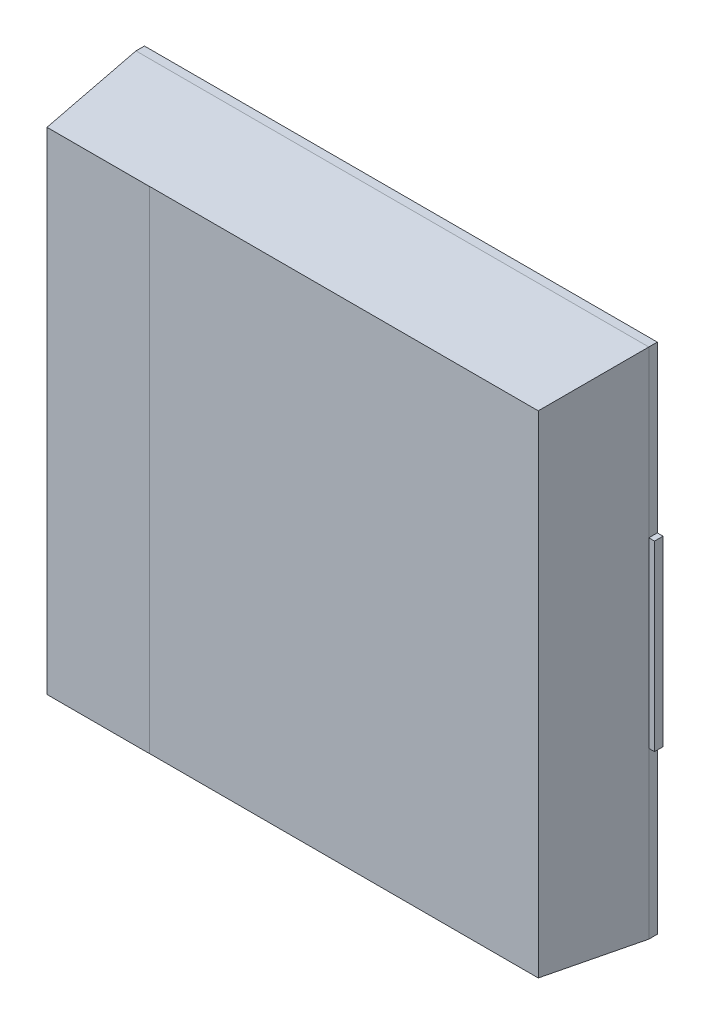
ISO-10303-21;
HEADER;
FILE_DESCRIPTION(('STEP AP214'),'2;1');
FILE_NAME('part.step','',(''),(''),'','','');
FILE_SCHEMA(('AUTOMOTIVE_DESIGN { 1 0 10303 214 1 1 1 1 }'));
ENDSEC;
DATA;
#1=APPLICATION_CONTEXT('core data for automotive mechanical design processes');
#2=APPLICATION_PROTOCOL_DEFINITION('international standard','automotive_design',2000,#1);
#3=PRODUCT_CONTEXT('',#1,'mechanical');
#4=PRODUCT('Part','Part','',(#3));
#5=PRODUCT_RELATED_PRODUCT_CATEGORY('part','',(#4));
#6=PRODUCT_DEFINITION_FORMATION('','',#4);
#7=PRODUCT_DEFINITION_CONTEXT('part definition',#1,'design');
#8=PRODUCT_DEFINITION('design','',#6,#7);
#9=PRODUCT_DEFINITION_SHAPE('','',#8);
#10=(LENGTH_UNIT() NAMED_UNIT(*) SI_UNIT(.MILLI.,.METRE.));
#11=(NAMED_UNIT(*) PLANE_ANGLE_UNIT() SI_UNIT($,.RADIAN.));
#12=(NAMED_UNIT(*) SI_UNIT($,.STERADIAN.) SOLID_ANGLE_UNIT());
#13=UNCERTAINTY_MEASURE_WITH_UNIT(LENGTH_MEASURE(1.E-05),#10,'distance_accuracy_value','');
#14=(GEOMETRIC_REPRESENTATION_CONTEXT(3) GLOBAL_UNCERTAINTY_ASSIGNED_CONTEXT((#13)) GLOBAL_UNIT_ASSIGNED_CONTEXT((#10,
#11,#12)) REPRESENTATION_CONTEXT('',''));
#15=CARTESIAN_POINT('',(0.,0.,0.));
#16=DIRECTION('',(0.,0.,1.));
#17=DIRECTION('',(1.,0.,0.));
#18=AXIS2_PLACEMENT_3D('',#15,#16,#17);
#19=CARTESIAN_POINT('',(0.,0.,0.001));
#20=DIRECTION('',(0.,0.,1.));
#21=DIRECTION('',(1.,0.,0.));
#22=AXIS2_PLACEMENT_3D('',#19,#20,#21);
#23=PLANE('',#22);
#24=DIRECTION('',(0.,1.,0.));
#25=VECTOR('',#24,1.);
#26=CARTESIAN_POINT('',(4.5,-4.5,0.001));
#27=LINE('',#26,#25);
#28=CARTESIAN_POINT('',(4.5,-4.5,0.001));
#29=VERTEX_POINT('',#28);
#30=CARTESIAN_POINT('',(4.5,4.5,0.001));
#31=VERTEX_POINT('',#30);
#32=EDGE_CURVE('P0_E11',#29,#31,#27,.T.);
#33=ORIENTED_EDGE('',*,*,#32,.F.);
#34=DIRECTION('',(1.,0.,0.));
#35=VECTOR('',#34,1.);
#36=CARTESIAN_POINT('',(-4.5,-4.5,0.001));
#37=LINE('',#36,#35);
#38=CARTESIAN_POINT('',(-4.5,-4.5,0.001));
#39=VERTEX_POINT('',#38);
#40=EDGE_CURVE('P0_E96',#39,#29,#37,.T.);
#41=ORIENTED_EDGE('',*,*,#40,.F.);
#42=DIRECTION('',(0.,-1.,0.));
#43=VECTOR('',#42,1.);
#44=CARTESIAN_POINT('',(-4.5,4.5,0.001));
#45=LINE('',#44,#43);
#46=CARTESIAN_POINT('',(-4.5,4.5,0.001));
#47=VERTEX_POINT('',#46);
#48=EDGE_CURVE('P0_E83',#47,#39,#45,.T.);
#49=ORIENTED_EDGE('',*,*,#48,.F.);
#50=DIRECTION('',(-1.,0.,0.));
#51=VECTOR('',#50,1.);
#52=CARTESIAN_POINT('',(4.5,4.5,0.001));
#53=LINE('',#52,#51);
#54=EDGE_CURVE('P0_E26',#31,#47,#53,.T.);
#55=ORIENTED_EDGE('',*,*,#54,.F.);
#56=EDGE_LOOP('',(#33,#41,#49,#55));
#57=FACE_BOUND('',#56,.T.);
#58=ADVANCED_FACE('P0_F17',(#57),#23,.F.);
#59=CARTESIAN_POINT('',(4.5,-4.5,0.001));
#60=DIRECTION('',(1.,0.,0.));
#61=DIRECTION('',(0.,1.,0.));
#62=AXIS2_PLACEMENT_3D('',#59,#60,#61);
#63=PLANE('',#62);
#64=DIRECTION('',(0.,1.,0.));
#65=VECTOR('',#64,1.);
#66=CARTESIAN_POINT('',(4.5,-2.25,0.15));
#67=LINE('',#66,#65);
#68=CARTESIAN_POINT('',(4.5,-4.5,0.15));
#69=VERTEX_POINT('',#68);
#70=CARTESIAN_POINT('',(4.5,4.5,0.15));
#71=VERTEX_POINT('',#70);
#72=EDGE_CURVE('P0_E133',#69,#71,#67,.T.);
#73=ORIENTED_EDGE('',*,*,#72,.F.);
#74=DIRECTION('',(0.,0.,1.));
#75=VECTOR('',#74,1.);
#76=CARTESIAN_POINT('',(4.5,-4.5,0.001));
#77=LINE('',#76,#75);
#78=EDGE_CURVE('P0_E99',#29,#69,#77,.T.);
#79=ORIENTED_EDGE('',*,*,#78,.F.);
#80=ORIENTED_EDGE('',*,*,#32,.T.);
#81=DIRECTION('',(0.,0.,1.));
#82=VECTOR('',#81,1.);
#83=CARTESIAN_POINT('',(4.5,4.5,0.001));
#84=LINE('',#83,#82);
#85=EDGE_CURVE('P0_E93',#31,#71,#84,.T.);
#86=ORIENTED_EDGE('',*,*,#85,.T.);
#87=EDGE_LOOP('',(#73,#79,#80,#86));
#88=FACE_BOUND('',#87,.T.);
#89=ADVANCED_FACE('P0_F19',(#88),#63,.T.);
#90=CARTESIAN_POINT('',(4.5,4.5,0.001));
#91=DIRECTION('',(0.,1.,0.));
#92=DIRECTION('',(1.,0.,0.));
#93=AXIS2_PLACEMENT_3D('',#90,#91,#92);
#94=PLANE('',#93);
#95=DIRECTION('',(-1.,0.,0.));
#96=VECTOR('',#95,1.);
#97=CARTESIAN_POINT('',(2.25,4.5,0.15));
#98=LINE('',#97,#96);
#99=CARTESIAN_POINT('',(-4.5,4.5,0.15));
#100=VERTEX_POINT('',#99);
#101=EDGE_CURVE('P0_E128',#71,#100,#98,.T.);
#102=ORIENTED_EDGE('',*,*,#101,.F.);
#103=ORIENTED_EDGE('',*,*,#85,.F.);
#104=ORIENTED_EDGE('',*,*,#54,.T.);
#105=DIRECTION('',(0.,0.,1.));
#106=VECTOR('',#105,1.);
#107=CARTESIAN_POINT('',(-4.5,4.5,0.001));
#108=LINE('',#107,#106);
#109=EDGE_CURVE('P0_E90',#47,#100,#108,.T.);
#110=ORIENTED_EDGE('',*,*,#109,.T.);
#111=EDGE_LOOP('',(#102,#103,#104,#110));
#112=FACE_BOUND('',#111,.T.);
#113=ADVANCED_FACE('P0_F242',(#112),#94,.T.);
#114=CARTESIAN_POINT('',(0.,0.,1.9));
#115=DIRECTION('',(0.,0.,1.));
#116=DIRECTION('',(1.,0.,0.));
#117=AXIS2_PLACEMENT_3D('',#114,#115,#116);
#118=PLANE('',#117);
#119=DIRECTION('',(0.,1.,0.));
#120=VECTOR('',#119,1.);
#121=CARTESIAN_POINT('',(-4.31,2.25,1.9));
#122=LINE('',#121,#120);
#123=CARTESIAN_POINT('',(-4.31,-4.31,1.9));
#124=VERTEX_POINT('',#123);
#125=CARTESIAN_POINT('',(-4.31,4.31,1.9));
#126=VERTEX_POINT('',#125);
#127=EDGE_CURVE('P0_E217',#124,#126,#122,.T.);
#128=ORIENTED_EDGE('',*,*,#127,.F.);
#129=DIRECTION('',(-1.,0.,0.));
#130=VECTOR('',#129,1.);
#131=CARTESIAN_POINT('',(-2.25,-4.31,1.9));
#132=LINE('',#131,#130);
#133=CARTESIAN_POINT('',(4.31,-4.31,1.9));
#134=VERTEX_POINT('',#133);
#135=EDGE_CURVE('P0_E106',#134,#124,#132,.T.);
#136=ORIENTED_EDGE('',*,*,#135,.F.);
#137=DIRECTION('',(0.,-1.,0.));
#138=VECTOR('',#137,1.);
#139=CARTESIAN_POINT('',(4.31,-2.25,1.9));
#140=LINE('',#139,#138);
#141=CARTESIAN_POINT('',(4.31,4.31,1.9));
#142=VERTEX_POINT('',#141);
#143=EDGE_CURVE('P0_E123',#142,#134,#140,.T.);
#144=ORIENTED_EDGE('',*,*,#143,.F.);
#145=DIRECTION('',(1.,0.,0.));
#146=VECTOR('',#145,1.);
#147=CARTESIAN_POINT('',(2.25,4.31,1.9));
#148=LINE('',#147,#146);
#149=EDGE_CURVE('P0_E131',#126,#142,#148,.T.);
#150=ORIENTED_EDGE('',*,*,#149,.F.);
#151=EDGE_LOOP('',(#128,#136,#144,#150));
#152=FACE_BOUND('',#151,.T.);
#153=ADVANCED_FACE('P0_F229',(#152),#118,.T.);
#154=CARTESIAN_POINT('',(-4.5,4.5,0.001));
#155=DIRECTION('',(-1.,0.,0.));
#156=DIRECTION('',(0.,0.,1.));
#157=AXIS2_PLACEMENT_3D('',#154,#155,#156);
#158=PLANE('',#157);
#159=DIRECTION('',(0.,-1.,0.));
#160=VECTOR('',#159,1.);
#161=CARTESIAN_POINT('',(-4.5,2.25,0.15));
#162=LINE('',#161,#160);
#163=CARTESIAN_POINT('',(-4.5,-4.5,0.15));
#164=VERTEX_POINT('',#163);
#165=EDGE_CURVE('P0_E118',#100,#164,#162,.T.);
#166=ORIENTED_EDGE('',*,*,#165,.F.);
#167=ORIENTED_EDGE('',*,*,#109,.F.);
#168=ORIENTED_EDGE('',*,*,#48,.T.);
#169=DIRECTION('',(0.,0.,1.));
#170=VECTOR('',#169,1.);
#171=CARTESIAN_POINT('',(-4.5,-4.5,0.001));
#172=LINE('',#171,#170);
#173=EDGE_CURVE('P0_E88',#39,#164,#172,.T.);
#174=ORIENTED_EDGE('',*,*,#173,.T.);
#175=EDGE_LOOP('',(#166,#167,#168,#174));
#176=FACE_BOUND('',#175,.T.);
#177=ADVANCED_FACE('P0_F86',(#176),#158,.T.);
#178=CARTESIAN_POINT('',(-4.5,-4.5,0.001));
#179=DIRECTION('',(0.,-1.,0.));
#180=DIRECTION('',(0.,0.,-1.));
#181=AXIS2_PLACEMENT_3D('',#178,#179,#180);
#182=PLANE('',#181);
#183=DIRECTION('',(1.,0.,0.));
#184=VECTOR('',#183,1.);
#185=CARTESIAN_POINT('',(-2.25,-4.5,0.15));
#186=LINE('',#185,#184);
#187=EDGE_CURVE('P0_E103',#164,#69,#186,.T.);
#188=ORIENTED_EDGE('',*,*,#187,.F.);
#189=ORIENTED_EDGE('',*,*,#173,.F.);
#190=ORIENTED_EDGE('',*,*,#40,.T.);
#191=ORIENTED_EDGE('',*,*,#78,.T.);
#192=EDGE_LOOP('',(#188,#189,#190,#191));
#193=FACE_BOUND('',#192,.T.);
#194=ADVANCED_FACE('P0_F101',(#193),#182,.T.);
#195=CARTESIAN_POINT('',(-2.25,-4.405,1.025));
#196=DIRECTION('',(0.,-0.994157722511084,0.107937124158346));
#197=DIRECTION('',(-1.,0.,0.));
#198=AXIS2_PLACEMENT_3D('',#195,#196,#197);
#199=PLANE('',#198);
#200=ORIENTED_EDGE('',*,*,#187,.T.);
#201=DIRECTION('',(0.107313808752573,-0.107313808752574,-0.988416659563178));
#202=VECTOR('',#201,1.);
#203=CARTESIAN_POINT('',(4.31,-4.31,1.9));
#204=LINE('',#203,#202);
#205=EDGE_CURVE('P0_E127',#134,#69,#204,.T.);
#206=ORIENTED_EDGE('',*,*,#205,.F.);
#207=ORIENTED_EDGE('',*,*,#135,.T.);
#208=DIRECTION('',(-0.107313808752574,-0.107313808752573,-0.988416659563178));
#209=VECTOR('',#208,1.);
#210=CARTESIAN_POINT('',(-4.31,-4.31,1.9));
#211=LINE('',#210,#209);
#212=EDGE_CURVE('P0_E122',#124,#164,#211,.T.);
#213=ORIENTED_EDGE('',*,*,#212,.T.);
#214=EDGE_LOOP('',(#200,#206,#207,#213));
#215=FACE_BOUND('',#214,.T.);
#216=ADVANCED_FACE('P0_F234',(#215),#199,.T.);
#217=CARTESIAN_POINT('',(4.405,-2.25,1.025));
#218=DIRECTION('',(0.994157722511084,0.,0.107937124158346));
#219=DIRECTION('',(0.,-1.,0.));
#220=AXIS2_PLACEMENT_3D('',#217,#218,#219);
#221=PLANE('',#220);
#222=ORIENTED_EDGE('',*,*,#143,.T.);
#223=ORIENTED_EDGE('',*,*,#205,.T.);
#224=ORIENTED_EDGE('',*,*,#72,.T.);
#225=DIRECTION('',(0.107313808752574,0.107313808752573,-0.988416659563178));
#226=VECTOR('',#225,1.);
#227=CARTESIAN_POINT('',(4.31,4.31,1.9));
#228=LINE('',#227,#226);
#229=EDGE_CURVE('P0_E138',#142,#71,#228,.T.);
#230=ORIENTED_EDGE('',*,*,#229,.F.);
#231=EDGE_LOOP('',(#222,#223,#224,#230));
#232=FACE_BOUND('',#231,.T.);
#233=ADVANCED_FACE('P0_F238',(#232),#221,.T.);
#234=CARTESIAN_POINT('',(2.25,4.405,1.025));
#235=DIRECTION('',(0.,0.994157722511084,0.107937124158346));
#236=DIRECTION('',(1.,0.,0.));
#237=AXIS2_PLACEMENT_3D('',#234,#235,#236);
#238=PLANE('',#237);
#239=ORIENTED_EDGE('',*,*,#149,.T.);
#240=ORIENTED_EDGE('',*,*,#229,.T.);
#241=ORIENTED_EDGE('',*,*,#101,.T.);
#242=DIRECTION('',(-0.107313808752573,0.107313808752574,-0.988416659563178));
#243=VECTOR('',#242,1.);
#244=CARTESIAN_POINT('',(-4.31,4.31,1.9));
#245=LINE('',#244,#243);
#246=EDGE_CURVE('P0_E116',#126,#100,#245,.T.);
#247=ORIENTED_EDGE('',*,*,#246,.F.);
#248=EDGE_LOOP('',(#239,#240,#241,#247));
#249=FACE_BOUND('',#248,.T.);
#250=ADVANCED_FACE('P0_F241',(#249),#238,.T.);
#251=CARTESIAN_POINT('',(-4.405,2.25,1.025));
#252=DIRECTION('',(-0.994157722511084,0.,0.107937124158346));
#253=DIRECTION('',(0.,1.,0.));
#254=AXIS2_PLACEMENT_3D('',#251,#252,#253);
#255=PLANE('',#254);
#256=ORIENTED_EDGE('',*,*,#127,.T.);
#257=ORIENTED_EDGE('',*,*,#246,.T.);
#258=ORIENTED_EDGE('',*,*,#165,.T.);
#259=ORIENTED_EDGE('',*,*,#212,.F.);
#260=EDGE_LOOP('',(#256,#257,#258,#259));
#261=FACE_BOUND('',#260,.T.);
#262=ADVANCED_FACE('P0_F226',(#261),#255,.T.);
#263=CLOSED_SHELL('',(#58,#89,#113,#153,#177,#194,#216,#233,#250,#262));
#264=MANIFOLD_SOLID_BREP('P0_B1',#263);
#265=CARTESIAN_POINT('',(-3.41,0.,1.9));
#266=DIRECTION('',(0.,0.,1.));
#267=DIRECTION('',(1.,0.,0.));
#268=AXIS2_PLACEMENT_3D('',#265,#266,#267);
#269=PLANE('',#268);
#270=DIRECTION('',(0.,-1.,0.));
#271=VECTOR('',#270,1.);
#272=CARTESIAN_POINT('',(-4.31,4.31,1.9));
#273=LINE('',#272,#271);
#274=CARTESIAN_POINT('',(-4.31,4.31,1.9));
#275=VERTEX_POINT('',#274);
#276=CARTESIAN_POINT('',(-4.31,-4.31,1.9));
#277=VERTEX_POINT('',#276);
#278=EDGE_CURVE('P1_E25',#275,#277,#273,.T.);
#279=ORIENTED_EDGE('',*,*,#278,.F.);
#280=DIRECTION('',(-1.,0.,0.));
#281=VECTOR('',#280,1.);
#282=CARTESIAN_POINT('',(-2.51,4.31,1.9));
#283=LINE('',#282,#281);
#284=CARTESIAN_POINT('',(-2.51,4.31,1.9));
#285=VERTEX_POINT('',#284);
#286=EDGE_CURVE('P1_E88',#285,#275,#283,.T.);
#287=ORIENTED_EDGE('',*,*,#286,.F.);
#288=DIRECTION('',(0.,1.,0.));
#289=VECTOR('',#288,1.);
#290=CARTESIAN_POINT('',(-2.51,-4.31,1.9));
#291=LINE('',#290,#289);
#292=CARTESIAN_POINT('',(-2.51,-4.31,1.9));
#293=VERTEX_POINT('',#292);
#294=EDGE_CURVE('P1_E70',#293,#285,#291,.T.);
#295=ORIENTED_EDGE('',*,*,#294,.F.);
#296=DIRECTION('',(1.,0.,0.));
#297=VECTOR('',#296,1.);
#298=CARTESIAN_POINT('',(-4.31,-4.31,1.9));
#299=LINE('',#298,#297);
#300=EDGE_CURVE('P1_E108',#277,#293,#299,.T.);
#301=ORIENTED_EDGE('',*,*,#300,.F.);
#302=EDGE_LOOP('',(#279,#287,#295,#301));
#303=FACE_BOUND('',#302,.T.);
#304=ADVANCED_FACE('P1_F17',(#303),#269,.F.);
#305=CARTESIAN_POINT('',(-3.41,0.,1.902));
#306=DIRECTION('',(0.,0.,1.));
#307=DIRECTION('',(1.,0.,0.));
#308=AXIS2_PLACEMENT_3D('',#305,#306,#307);
#309=PLANE('',#308);
#310=DIRECTION('',(0.,-1.,0.));
#311=VECTOR('',#310,1.);
#312=CARTESIAN_POINT('',(-4.31,4.31,1.902));
#313=LINE('',#312,#311);
#314=CARTESIAN_POINT('',(-4.31,4.31,1.902));
#315=VERTEX_POINT('',#314);
#316=CARTESIAN_POINT('',(-4.31,-4.31,1.902));
#317=VERTEX_POINT('',#316);
#318=EDGE_CURVE('P1_E11',#315,#317,#313,.T.);
#319=ORIENTED_EDGE('',*,*,#318,.T.);
#320=DIRECTION('',(1.,0.,0.));
#321=VECTOR('',#320,1.);
#322=CARTESIAN_POINT('',(-4.31,-4.31,1.902));
#323=LINE('',#322,#321);
#324=CARTESIAN_POINT('',(-2.51,-4.31,1.902));
#325=VERTEX_POINT('',#324);
#326=EDGE_CURVE('P1_E104',#317,#325,#323,.T.);
#327=ORIENTED_EDGE('',*,*,#326,.T.);
#328=DIRECTION('',(0.,1.,0.));
#329=VECTOR('',#328,1.);
#330=CARTESIAN_POINT('',(-2.51,-4.31,1.902));
#331=LINE('',#330,#329);
#332=CARTESIAN_POINT('',(-2.51,4.31,1.902));
#333=VERTEX_POINT('',#332);
#334=EDGE_CURVE('P1_E82',#325,#333,#331,.T.);
#335=ORIENTED_EDGE('',*,*,#334,.T.);
#336=DIRECTION('',(-1.,0.,0.));
#337=VECTOR('',#336,1.);
#338=CARTESIAN_POINT('',(-2.51,4.31,1.902));
#339=LINE('',#338,#337);
#340=EDGE_CURVE('P1_E89',#333,#315,#339,.T.);
#341=ORIENTED_EDGE('',*,*,#340,.T.);
#342=EDGE_LOOP('',(#319,#327,#335,#341));
#343=FACE_BOUND('',#342,.T.);
#344=ADVANCED_FACE('P1_F153',(#343),#309,.T.);
#345=CARTESIAN_POINT('',(-4.31,4.31,1.9));
#346=DIRECTION('',(-1.,0.,0.));
#347=DIRECTION('',(0.,0.,1.));
#348=AXIS2_PLACEMENT_3D('',#345,#346,#347);
#349=PLANE('',#348);
#350=ORIENTED_EDGE('',*,*,#278,.T.);
#351=DIRECTION('',(0.,0.,1.));
#352=VECTOR('',#351,1.);
#353=CARTESIAN_POINT('',(-4.31,-4.31,1.9));
#354=LINE('',#353,#352);
#355=EDGE_CURVE('P1_E107',#277,#317,#354,.T.);
#356=ORIENTED_EDGE('',*,*,#355,.T.);
#357=ORIENTED_EDGE('',*,*,#318,.F.);
#358=DIRECTION('',(0.,0.,1.));
#359=VECTOR('',#358,1.);
#360=CARTESIAN_POINT('',(-4.31,4.31,1.9));
#361=LINE('',#360,#359);
#362=EDGE_CURVE('P1_E93',#275,#315,#361,.T.);
#363=ORIENTED_EDGE('',*,*,#362,.F.);
#364=EDGE_LOOP('',(#350,#356,#357,#363));
#365=FACE_BOUND('',#364,.T.);
#366=ADVANCED_FACE('P1_F154',(#365),#349,.T.);
#367=CARTESIAN_POINT('',(-4.31,-4.31,1.9));
#368=DIRECTION('',(0.,-1.,0.));
#369=DIRECTION('',(0.,0.,-1.));
#370=AXIS2_PLACEMENT_3D('',#367,#368,#369);
#371=PLANE('',#370);
#372=ORIENTED_EDGE('',*,*,#300,.T.);
#373=DIRECTION('',(0.,0.,1.));
#374=VECTOR('',#373,1.);
#375=CARTESIAN_POINT('',(-2.51,-4.31,1.9));
#376=LINE('',#375,#374);
#377=EDGE_CURVE('P1_E77',#293,#325,#376,.T.);
#378=ORIENTED_EDGE('',*,*,#377,.T.);
#379=ORIENTED_EDGE('',*,*,#326,.F.);
#380=ORIENTED_EDGE('',*,*,#355,.F.);
#381=EDGE_LOOP('',(#372,#378,#379,#380));
#382=FACE_BOUND('',#381,.T.);
#383=ADVANCED_FACE('P1_F157',(#382),#371,.T.);
#384=CARTESIAN_POINT('',(-2.51,-4.31,1.9));
#385=DIRECTION('',(1.,0.,0.));
#386=DIRECTION('',(0.,1.,0.));
#387=AXIS2_PLACEMENT_3D('',#384,#385,#386);
#388=PLANE('',#387);
#389=ORIENTED_EDGE('',*,*,#294,.T.);
#390=DIRECTION('',(0.,0.,1.));
#391=VECTOR('',#390,1.);
#392=CARTESIAN_POINT('',(-2.51,4.31,1.9));
#393=LINE('',#392,#391);
#394=EDGE_CURVE('P1_E74',#285,#333,#393,.T.);
#395=ORIENTED_EDGE('',*,*,#394,.T.);
#396=ORIENTED_EDGE('',*,*,#334,.F.);
#397=ORIENTED_EDGE('',*,*,#377,.F.);
#398=EDGE_LOOP('',(#389,#395,#396,#397));
#399=FACE_BOUND('',#398,.T.);
#400=ADVANCED_FACE('P1_F72',(#399),#388,.T.);
#401=CARTESIAN_POINT('',(-2.51,4.31,1.9));
#402=DIRECTION('',(0.,1.,0.));
#403=DIRECTION('',(1.,0.,0.));
#404=AXIS2_PLACEMENT_3D('',#401,#402,#403);
#405=PLANE('',#404);
#406=ORIENTED_EDGE('',*,*,#286,.T.);
#407=ORIENTED_EDGE('',*,*,#362,.T.);
#408=ORIENTED_EDGE('',*,*,#340,.F.);
#409=ORIENTED_EDGE('',*,*,#394,.F.);
#410=EDGE_LOOP('',(#406,#407,#408,#409));
#411=FACE_BOUND('',#410,.T.);
#412=ADVANCED_FACE('P1_F86',(#411),#405,.T.);
#413=CLOSED_SHELL('',(#304,#344,#366,#383,#400,#412));
#414=MANIFOLD_SOLID_BREP('P1_B1',#413);
#415=CARTESIAN_POINT('',(-4.1,1.6,0.075));
#416=DIRECTION('',(0.,1.,0.));
#417=DIRECTION('',(1.,0.,0.));
#418=AXIS2_PLACEMENT_3D('',#415,#416,#417);
#419=PLANE('',#418);
#420=DIRECTION('',(0.,0.,1.));
#421=VECTOR('',#420,1.);
#422=CARTESIAN_POINT('',(-4.6,1.6,0.));
#423=LINE('',#422,#421);
#424=CARTESIAN_POINT('',(-4.6,1.6,0.));
#425=VERTEX_POINT('',#424);
#426=CARTESIAN_POINT('',(-4.6,1.6,0.15));
#427=VERTEX_POINT('',#426);
#428=EDGE_CURVE('P2_E11',#425,#427,#423,.T.);
#429=ORIENTED_EDGE('',*,*,#428,.T.);
#430=DIRECTION('',(1.,0.,0.));
#431=VECTOR('',#430,1.);
#432=CARTESIAN_POINT('',(-4.6,1.6,0.15));
#433=LINE('',#432,#431);
#434=CARTESIAN_POINT('',(-3.6,1.6,0.15));
#435=VERTEX_POINT('',#434);
#436=EDGE_CURVE('P2_E42',#427,#435,#433,.T.);
#437=ORIENTED_EDGE('',*,*,#436,.T.);
#438=DIRECTION('',(0.,0.,-1.));
#439=VECTOR('',#438,1.);
#440=CARTESIAN_POINT('',(-3.6,1.6,0.15));
#441=LINE('',#440,#439);
#442=CARTESIAN_POINT('',(-3.6,1.6,0.));
#443=VERTEX_POINT('',#442);
#444=EDGE_CURVE('P2_E108',#435,#443,#441,.T.);
#445=ORIENTED_EDGE('',*,*,#444,.T.);
#446=DIRECTION('',(-1.,0.,0.));
#447=VECTOR('',#446,1.);
#448=CARTESIAN_POINT('',(-3.6,1.6,0.));
#449=LINE('',#448,#447);
#450=EDGE_CURVE('P2_E97',#443,#425,#449,.T.);
#451=ORIENTED_EDGE('',*,*,#450,.T.);
#452=EDGE_LOOP('',(#429,#437,#445,#451));
#453=FACE_BOUND('',#452,.T.);
#454=ADVANCED_FACE('P2_F17',(#453),#419,.T.);
#455=CARTESIAN_POINT('',(-4.6,0.,0.));
#456=DIRECTION('',(-1.,0.,0.));
#457=DIRECTION('',(0.,0.,1.));
#458=AXIS2_PLACEMENT_3D('',#455,#456,#457);
#459=PLANE('',#458);
#460=DIRECTION('',(0.,1.,0.));
#461=VECTOR('',#460,1.);
#462=CARTESIAN_POINT('',(-4.6,0.,0.15));
#463=LINE('',#462,#461);
#464=CARTESIAN_POINT('',(-4.6,-1.6,0.15));
#465=VERTEX_POINT('',#464);
#466=EDGE_CURVE('P2_E25',#465,#427,#463,.T.);
#467=ORIENTED_EDGE('',*,*,#466,.T.);
#468=ORIENTED_EDGE('',*,*,#428,.F.);
#469=DIRECTION('',(0.,-1.,0.));
#470=VECTOR('',#469,1.);
#471=CARTESIAN_POINT('',(-4.6,0.,0.));
#472=LINE('',#471,#470);
#473=CARTESIAN_POINT('',(-4.6,-1.6,0.));
#474=VERTEX_POINT('',#473);
#475=EDGE_CURVE('P2_E83',#425,#474,#472,.T.);
#476=ORIENTED_EDGE('',*,*,#475,.T.);
#477=DIRECTION('',(0.,0.,-1.));
#478=VECTOR('',#477,1.);
#479=CARTESIAN_POINT('',(-4.6,-1.6,0.));
#480=LINE('',#479,#478);
#481=EDGE_CURVE('P2_E79',#465,#474,#480,.T.);
#482=ORIENTED_EDGE('',*,*,#481,.F.);
#483=EDGE_LOOP('',(#467,#468,#476,#482));
#484=FACE_BOUND('',#483,.T.);
#485=ADVANCED_FACE('P2_F85',(#484),#459,.T.);
#486=CARTESIAN_POINT('',(-4.6,0.,0.15));
#487=DIRECTION('',(0.,0.,1.));
#488=DIRECTION('',(1.,0.,0.));
#489=AXIS2_PLACEMENT_3D('',#486,#487,#488);
#490=PLANE('',#489);
#491=DIRECTION('',(0.,1.,0.));
#492=VECTOR('',#491,1.);
#493=CARTESIAN_POINT('',(-3.6,0.,0.15));
#494=LINE('',#493,#492);
#495=CARTESIAN_POINT('',(-3.6,-1.6,0.15));
#496=VERTEX_POINT('',#495);
#497=EDGE_CURVE('P2_E111',#496,#435,#494,.T.);
#498=ORIENTED_EDGE('',*,*,#497,.T.);
#499=ORIENTED_EDGE('',*,*,#436,.F.);
#500=ORIENTED_EDGE('',*,*,#466,.F.);
#501=DIRECTION('',(-1.,0.,0.));
#502=VECTOR('',#501,1.);
#503=CARTESIAN_POINT('',(-4.6,-1.6,0.15));
#504=LINE('',#503,#502);
#505=EDGE_CURVE('P2_E70',#496,#465,#504,.T.);
#506=ORIENTED_EDGE('',*,*,#505,.F.);
#507=EDGE_LOOP('',(#498,#499,#500,#506));
#508=FACE_BOUND('',#507,.T.);
#509=ADVANCED_FACE('P2_F69',(#508),#490,.T.);
#510=CARTESIAN_POINT('',(-3.6,0.,0.15));
#511=DIRECTION('',(1.,0.,0.));
#512=DIRECTION('',(0.,1.,0.));
#513=AXIS2_PLACEMENT_3D('',#510,#511,#512);
#514=PLANE('',#513);
#515=DIRECTION('',(0.,1.,0.));
#516=VECTOR('',#515,1.);
#517=CARTESIAN_POINT('',(-3.6,0.,0.));
#518=LINE('',#517,#516);
#519=CARTESIAN_POINT('',(-3.6,-1.6,0.));
#520=VERTEX_POINT('',#519);
#521=EDGE_CURVE('P2_E100',#520,#443,#518,.T.);
#522=ORIENTED_EDGE('',*,*,#521,.T.);
#523=ORIENTED_EDGE('',*,*,#444,.F.);
#524=ORIENTED_EDGE('',*,*,#497,.F.);
#525=DIRECTION('',(0.,0.,1.));
#526=VECTOR('',#525,1.);
#527=CARTESIAN_POINT('',(-3.6,-1.6,0.15));
#528=LINE('',#527,#526);
#529=EDGE_CURVE('P2_E81',#520,#496,#528,.T.);
#530=ORIENTED_EDGE('',*,*,#529,.F.);
#531=EDGE_LOOP('',(#522,#523,#524,#530));
#532=FACE_BOUND('',#531,.T.);
#533=ADVANCED_FACE('P2_F169',(#532),#514,.T.);
#534=CARTESIAN_POINT('',(-3.6,0.,0.));
#535=DIRECTION('',(0.,0.,-1.));
#536=DIRECTION('',(0.,-1.,0.));
#537=AXIS2_PLACEMENT_3D('',#534,#535,#536);
#538=PLANE('',#537);
#539=ORIENTED_EDGE('',*,*,#475,.F.);
#540=ORIENTED_EDGE('',*,*,#450,.F.);
#541=ORIENTED_EDGE('',*,*,#521,.F.);
#542=DIRECTION('',(1.,0.,0.));
#543=VECTOR('',#542,1.);
#544=CARTESIAN_POINT('',(-3.6,-1.6,0.));
#545=LINE('',#544,#543);
#546=EDGE_CURVE('P2_E89',#474,#520,#545,.T.);
#547=ORIENTED_EDGE('',*,*,#546,.F.);
#548=EDGE_LOOP('',(#539,#540,#541,#547));
#549=FACE_BOUND('',#548,.T.);
#550=ADVANCED_FACE('P2_F158',(#549),#538,.T.);
#551=CARTESIAN_POINT('',(-4.1,-1.6,0.075));
#552=DIRECTION('',(0.,-1.,0.));
#553=DIRECTION('',(0.,0.,-1.));
#554=AXIS2_PLACEMENT_3D('',#551,#552,#553);
#555=PLANE('',#554);
#556=ORIENTED_EDGE('',*,*,#481,.T.);
#557=ORIENTED_EDGE('',*,*,#546,.T.);
#558=ORIENTED_EDGE('',*,*,#529,.T.);
#559=ORIENTED_EDGE('',*,*,#505,.T.);
#560=EDGE_LOOP('',(#556,#557,#558,#559));
#561=FACE_BOUND('',#560,.T.);
#562=ADVANCED_FACE('P2_F77',(#561),#555,.T.);
#563=CLOSED_SHELL('',(#454,#485,#509,#533,#550,#562));
#564=MANIFOLD_SOLID_BREP('P2_B1',#563);
#565=CARTESIAN_POINT('',(4.1,1.6,0.075));
#566=DIRECTION('',(0.,1.,0.));
#567=DIRECTION('',(1.,0.,0.));
#568=AXIS2_PLACEMENT_3D('',#565,#566,#567);
#569=PLANE('',#568);
#570=DIRECTION('',(-1.,0.,0.));
#571=VECTOR('',#570,1.);
#572=CARTESIAN_POINT('',(3.6,1.6,0.));
#573=LINE('',#572,#571);
#574=CARTESIAN_POINT('',(4.6,1.6,0.));
#575=VERTEX_POINT('',#574);
#576=CARTESIAN_POINT('',(3.6,1.6,0.));
#577=VERTEX_POINT('',#576);
#578=EDGE_CURVE('P3_E11',#575,#577,#573,.T.);
#579=ORIENTED_EDGE('',*,*,#578,.T.);
#580=DIRECTION('',(0.,0.,1.));
#581=VECTOR('',#580,1.);
#582=CARTESIAN_POINT('',(3.6,1.6,0.15));
#583=LINE('',#582,#581);
#584=CARTESIAN_POINT('',(3.6,1.6,0.15));
#585=VERTEX_POINT('',#584);
#586=EDGE_CURVE('P3_E45',#577,#585,#583,.T.);
#587=ORIENTED_EDGE('',*,*,#586,.T.);
#588=DIRECTION('',(1.,0.,0.));
#589=VECTOR('',#588,1.);
#590=CARTESIAN_POINT('',(4.6,1.6,0.15));
#591=LINE('',#590,#589);
#592=CARTESIAN_POINT('',(4.6,1.6,0.15));
#593=VERTEX_POINT('',#592);
#594=EDGE_CURVE('P3_E108',#585,#593,#591,.T.);
#595=ORIENTED_EDGE('',*,*,#594,.T.);
#596=DIRECTION('',(0.,0.,-1.));
#597=VECTOR('',#596,1.);
#598=CARTESIAN_POINT('',(4.6,1.6,0.));
#599=LINE('',#598,#597);
#600=EDGE_CURVE('P3_E100',#593,#575,#599,.T.);
#601=ORIENTED_EDGE('',*,*,#600,.T.);
#602=EDGE_LOOP('',(#579,#587,#595,#601));
#603=FACE_BOUND('',#602,.T.);
#604=ADVANCED_FACE('P3_F17',(#603),#569,.T.);
#605=CARTESIAN_POINT('',(4.6,0.,0.));
#606=DIRECTION('',(0.,0.,-1.));
#607=DIRECTION('',(0.,-1.,0.));
#608=AXIS2_PLACEMENT_3D('',#605,#606,#607);
#609=PLANE('',#608);
#610=DIRECTION('',(0.,1.,0.));
#611=VECTOR('',#610,1.);
#612=CARTESIAN_POINT('',(3.6,0.,0.));
#613=LINE('',#612,#611);
#614=CARTESIAN_POINT('',(3.6,-1.6,0.));
#615=VERTEX_POINT('',#614);
#616=EDGE_CURVE('P3_E26',#615,#577,#613,.T.);
#617=ORIENTED_EDGE('',*,*,#616,.T.);
#618=ORIENTED_EDGE('',*,*,#578,.F.);
#619=DIRECTION('',(0.,-1.,0.));
#620=VECTOR('',#619,1.);
#621=CARTESIAN_POINT('',(4.6,0.,0.));
#622=LINE('',#621,#620);
#623=CARTESIAN_POINT('',(4.6,-1.6,0.));
#624=VERTEX_POINT('',#623);
#625=EDGE_CURVE('P3_E85',#575,#624,#622,.T.);
#626=ORIENTED_EDGE('',*,*,#625,.T.);
#627=DIRECTION('',(1.,0.,0.));
#628=VECTOR('',#627,1.);
#629=CARTESIAN_POINT('',(3.6,-1.6,0.));
#630=LINE('',#629,#628);
#631=EDGE_CURVE('P3_E81',#615,#624,#630,.T.);
#632=ORIENTED_EDGE('',*,*,#631,.F.);
#633=EDGE_LOOP('',(#617,#618,#626,#632));
#634=FACE_BOUND('',#633,.T.);
#635=ADVANCED_FACE('P3_F19',(#634),#609,.T.);
#636=CARTESIAN_POINT('',(3.6,0.,0.));
#637=DIRECTION('',(-1.,0.,0.));
#638=DIRECTION('',(0.,0.,1.));
#639=AXIS2_PLACEMENT_3D('',#636,#637,#638);
#640=PLANE('',#639);
#641=DIRECTION('',(0.,1.,0.));
#642=VECTOR('',#641,1.);
#643=CARTESIAN_POINT('',(3.6,0.,0.15));
#644=LINE('',#643,#642);
#645=CARTESIAN_POINT('',(3.6,-1.6,0.15));
#646=VERTEX_POINT('',#645);
#647=EDGE_CURVE('P3_E111',#646,#585,#644,.T.);
#648=ORIENTED_EDGE('',*,*,#647,.T.);
#649=ORIENTED_EDGE('',*,*,#586,.F.);
#650=ORIENTED_EDGE('',*,*,#616,.F.);
#651=DIRECTION('',(0.,0.,-1.));
#652=VECTOR('',#651,1.);
#653=CARTESIAN_POINT('',(3.6,-1.6,0.15));
#654=LINE('',#653,#652);
#655=EDGE_CURVE('P3_E71',#646,#615,#654,.T.);
#656=ORIENTED_EDGE('',*,*,#655,.F.);
#657=EDGE_LOOP('',(#648,#649,#650,#656));
#658=FACE_BOUND('',#657,.T.);
#659=ADVANCED_FACE('P3_F70',(#658),#640,.T.);
#660=CARTESIAN_POINT('',(3.6,0.,0.15));
#661=DIRECTION('',(0.,0.,1.));
#662=DIRECTION('',(1.,0.,0.));
#663=AXIS2_PLACEMENT_3D('',#660,#661,#662);
#664=PLANE('',#663);
#665=DIRECTION('',(0.,1.,0.));
#666=VECTOR('',#665,1.);
#667=CARTESIAN_POINT('',(4.6,0.,0.15));
#668=LINE('',#667,#666);
#669=CARTESIAN_POINT('',(4.6,-1.6,0.15));
#670=VERTEX_POINT('',#669);
#671=EDGE_CURVE('P3_E104',#670,#593,#668,.T.);
#672=ORIENTED_EDGE('',*,*,#671,.T.);
#673=ORIENTED_EDGE('',*,*,#594,.F.);
#674=ORIENTED_EDGE('',*,*,#647,.F.);
#675=DIRECTION('',(-1.,0.,0.));
#676=VECTOR('',#675,1.);
#677=CARTESIAN_POINT('',(4.6,-1.6,0.15));
#678=LINE('',#677,#676);
#679=EDGE_CURVE('P3_E83',#670,#646,#678,.T.);
#680=ORIENTED_EDGE('',*,*,#679,.F.);
#681=EDGE_LOOP('',(#672,#673,#674,#680));
#682=FACE_BOUND('',#681,.T.);
#683=ADVANCED_FACE('P3_F170',(#682),#664,.T.);
#684=CARTESIAN_POINT('',(4.6,0.,0.15));
#685=DIRECTION('',(1.,0.,0.));
#686=DIRECTION('',(0.,1.,0.));
#687=AXIS2_PLACEMENT_3D('',#684,#685,#686);
#688=PLANE('',#687);
#689=ORIENTED_EDGE('',*,*,#625,.F.);
#690=ORIENTED_EDGE('',*,*,#600,.F.);
#691=ORIENTED_EDGE('',*,*,#671,.F.);
#692=DIRECTION('',(0.,0.,1.));
#693=VECTOR('',#692,1.);
#694=CARTESIAN_POINT('',(4.6,-1.6,0.));
#695=LINE('',#694,#693);
#696=EDGE_CURVE('P3_E90',#624,#670,#695,.T.);
#697=ORIENTED_EDGE('',*,*,#696,.F.);
#698=EDGE_LOOP('',(#689,#690,#691,#697));
#699=FACE_BOUND('',#698,.T.);
#700=ADVANCED_FACE('P3_F158',(#699),#688,.T.);
#701=CARTESIAN_POINT('',(4.1,-1.6,0.075));
#702=DIRECTION('',(0.,-1.,0.));
#703=DIRECTION('',(0.,0.,-1.));
#704=AXIS2_PLACEMENT_3D('',#701,#702,#703);
#705=PLANE('',#704);
#706=ORIENTED_EDGE('',*,*,#631,.T.);
#707=ORIENTED_EDGE('',*,*,#696,.T.);
#708=ORIENTED_EDGE('',*,*,#679,.T.);
#709=ORIENTED_EDGE('',*,*,#655,.T.);
#710=EDGE_LOOP('',(#706,#707,#708,#709));
#711=FACE_BOUND('',#710,.T.);
#712=ADVANCED_FACE('P3_F79',(#711),#705,.T.);
#713=CLOSED_SHELL('',(#604,#635,#659,#683,#700,#712));
#714=MANIFOLD_SOLID_BREP('P3_B1',#713);
#715=ADVANCED_BREP_SHAPE_REPRESENTATION('',(#18,#264,#414,#564,#714),#14);
#716=SHAPE_DEFINITION_REPRESENTATION(#9,#715);
ENDSEC;
END-ISO-10303-21;
